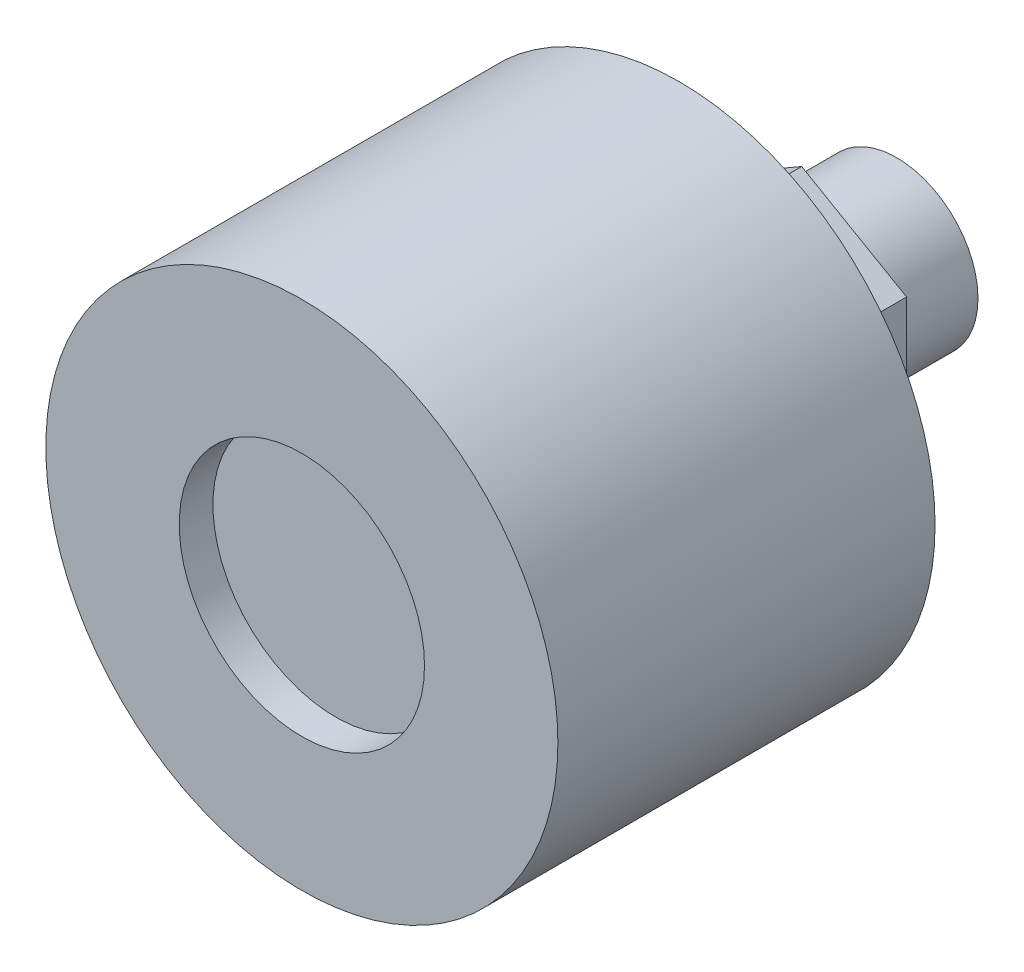
ISO-10303-21;
HEADER;
FILE_DESCRIPTION(('STEP AP214'),'2;1');
FILE_NAME('part.step','',(''),(''),'','','');
FILE_SCHEMA(('AUTOMOTIVE_DESIGN { 1 0 10303 214 1 1 1 1 }'));
ENDSEC;
DATA;
#1=APPLICATION_CONTEXT('core data for automotive mechanical design processes');
#2=APPLICATION_PROTOCOL_DEFINITION('international standard','automotive_design',2000,#1);
#3=PRODUCT_CONTEXT('',#1,'mechanical');
#4=PRODUCT('Part','Part','',(#3));
#5=PRODUCT_RELATED_PRODUCT_CATEGORY('part','',(#4));
#6=PRODUCT_DEFINITION_FORMATION('','',#4);
#7=PRODUCT_DEFINITION_CONTEXT('part definition',#1,'design');
#8=PRODUCT_DEFINITION('design','',#6,#7);
#9=PRODUCT_DEFINITION_SHAPE('','',#8);
#10=(LENGTH_UNIT() NAMED_UNIT(*) SI_UNIT(.MILLI.,.METRE.));
#11=(NAMED_UNIT(*) PLANE_ANGLE_UNIT() SI_UNIT($,.RADIAN.));
#12=(NAMED_UNIT(*) SI_UNIT($,.STERADIAN.) SOLID_ANGLE_UNIT());
#13=UNCERTAINTY_MEASURE_WITH_UNIT(LENGTH_MEASURE(1.E-05),#10,'distance_accuracy_value','');
#14=(GEOMETRIC_REPRESENTATION_CONTEXT(3) GLOBAL_UNCERTAINTY_ASSIGNED_CONTEXT((#13)) GLOBAL_UNIT_ASSIGNED_CONTEXT((#10,
#11,#12)) REPRESENTATION_CONTEXT('',''));
#15=CARTESIAN_POINT('',(0.,0.,0.));
#16=DIRECTION('',(0.,0.,1.));
#17=DIRECTION('',(1.,0.,0.));
#18=AXIS2_PLACEMENT_3D('',#15,#16,#17);
#19=CARTESIAN_POINT('',(0.,0.,-0.1));
#20=DIRECTION('',(0.,0.,1.));
#21=DIRECTION('',(1.,0.,0.));
#22=AXIS2_PLACEMENT_3D('',#19,#20,#21);
#23=CYLINDRICAL_SURFACE('',#22,8.35);
#24=CARTESIAN_POINT('',(0.,0.,1.));
#25=DIRECTION('',(0.,0.,1.));
#26=DIRECTION('',(1.,0.,0.));
#27=AXIS2_PLACEMENT_3D('',#24,#25,#26);
#28=CIRCLE('',#27,8.35);
#29=CARTESIAN_POINT('',(8.35,0.,1.));
#30=VERTEX_POINT('',#29);
#31=EDGE_CURVE('E120',#30,#30,#28,.T.);
#32=ORIENTED_EDGE('',*,*,#31,.F.);
#33=EDGE_LOOP('',(#32));
#34=FACE_BOUND('',#33,.T.);
#35=CARTESIAN_POINT('',(0.,0.,-11.3));
#36=DIRECTION('',(0.,0.,-1.));
#37=DIRECTION('',(-1.,0.,0.));
#38=AXIS2_PLACEMENT_3D('',#35,#36,#37);
#39=CIRCLE('',#38,8.35);
#40=CARTESIAN_POINT('',(-8.35,0.,-11.3));
#41=VERTEX_POINT('',#40);
#42=EDGE_CURVE('E110',#41,#41,#39,.T.);
#43=ORIENTED_EDGE('',*,*,#42,.F.);
#44=EDGE_LOOP('',(#43));
#45=FACE_BOUND('',#44,.T.);
#46=ADVANCED_FACE('F37',(#34,#45),#23,.T.);
#47=CARTESIAN_POINT('',(0.,0.,-0.1));
#48=DIRECTION('',(0.,0.,1.));
#49=DIRECTION('',(1.,0.,0.));
#50=AXIS2_PLACEMENT_3D('',#47,#48,#49);
#51=CYLINDRICAL_SURFACE('',#50,4.);
#52=CARTESIAN_POINT('',(0.,0.,-0.1));
#53=DIRECTION('',(0.,0.,1.));
#54=DIRECTION('',(1.,0.,0.));
#55=AXIS2_PLACEMENT_3D('',#52,#53,#54);
#56=CIRCLE('',#55,4.);
#57=CARTESIAN_POINT('',(4.,0.,-0.1));
#58=VERTEX_POINT('',#57);
#59=EDGE_CURVE('E40',#58,#58,#56,.T.);
#60=ORIENTED_EDGE('',*,*,#59,.F.);
#61=EDGE_LOOP('',(#60));
#62=FACE_BOUND('',#61,.T.);
#63=CARTESIAN_POINT('',(0.,0.,1.));
#64=DIRECTION('',(0.,0.,1.));
#65=DIRECTION('',(1.,0.,0.));
#66=AXIS2_PLACEMENT_3D('',#63,#64,#65);
#67=CIRCLE('',#66,4.);
#68=CARTESIAN_POINT('',(4.,0.,1.));
#69=VERTEX_POINT('',#68);
#70=EDGE_CURVE('E113',#69,#69,#67,.T.);
#71=ORIENTED_EDGE('',*,*,#70,.T.);
#72=EDGE_LOOP('',(#71));
#73=FACE_BOUND('',#72,.T.);
#74=ADVANCED_FACE('F129',(#62,#73),#51,.F.);
#75=CARTESIAN_POINT('',(0.,0.,1.));
#76=DIRECTION('',(0.,0.,1.));
#77=DIRECTION('',(1.,0.,0.));
#78=AXIS2_PLACEMENT_3D('',#75,#76,#77);
#79=PLANE('',#78);
#80=ORIENTED_EDGE('',*,*,#31,.T.);
#81=EDGE_LOOP('',(#80));
#82=FACE_BOUND('',#81,.T.);
#83=ORIENTED_EDGE('',*,*,#70,.F.);
#84=EDGE_LOOP('',(#83));
#85=FACE_BOUND('',#84,.T.);
#86=ADVANCED_FACE('F132',(#82,#85),#79,.T.);
#87=CARTESIAN_POINT('',(0.,0.,-0.1));
#88=DIRECTION('',(0.,0.,-1.));
#89=DIRECTION('',(-1.,0.,0.));
#90=AXIS2_PLACEMENT_3D('',#87,#88,#89);
#91=PLANE('',#90);
#92=ORIENTED_EDGE('',*,*,#59,.T.);
#93=EDGE_LOOP('',(#92));
#94=FACE_BOUND('',#93,.T.);
#95=ADVANCED_FACE('F127',(#94),#91,.F.);
#96=CARTESIAN_POINT('',(0.,0.,-11.3));
#97=DIRECTION('',(0.,0.,-1.));
#98=DIRECTION('',(-1.,0.,0.));
#99=AXIS2_PLACEMENT_3D('',#96,#97,#98);
#100=PLANE('',#99);
#101=DIRECTION('',(0.866025403784442,0.499999999999995,0.));
#102=VECTOR('',#101,1.);
#103=CARTESIAN_POINT('',(-3.42080034494851,1.97500000000004,-11.3));
#104=LINE('',#103,#102);
#105=CARTESIAN_POINT('',(-3.42080034494851,1.97500000000004,-11.3));
#106=VERTEX_POINT('',#105);
#107=CARTESIAN_POINT('',(0.,3.95,-11.3));
#108=VERTEX_POINT('',#107);
#109=EDGE_CURVE('E52',#106,#108,#104,.T.);
#110=ORIENTED_EDGE('',*,*,#109,.F.);
#111=DIRECTION('',(0.,1.,0.));
#112=VECTOR('',#111,1.);
#113=CARTESIAN_POINT('',(-3.42080034494855,-1.97499999999997,-11.3));
#114=LINE('',#113,#112);
#115=CARTESIAN_POINT('',(-3.42080034494855,-1.97499999999997,-11.3));
#116=VERTEX_POINT('',#115);
#117=EDGE_CURVE('E56',#116,#106,#114,.T.);
#118=ORIENTED_EDGE('',*,*,#117,.F.);
#119=DIRECTION('',(-0.866025403784436,0.500000000000004,0.));
#120=VECTOR('',#119,1.);
#121=CARTESIAN_POINT('',(0.,-3.95,-11.3));
#122=LINE('',#121,#120);
#123=CARTESIAN_POINT('',(0.,-3.95,-11.3));
#124=VERTEX_POINT('',#123);
#125=EDGE_CURVE('E221',#124,#116,#122,.T.);
#126=ORIENTED_EDGE('',*,*,#125,.F.);
#127=DIRECTION('',(-0.86602540378444,-0.499999999999998,0.));
#128=VECTOR('',#127,1.);
#129=CARTESIAN_POINT('',(3.42080034494852,-1.97500000000002,-11.3));
#130=LINE('',#129,#128);
#131=CARTESIAN_POINT('',(3.42080034494852,-1.97500000000002,-11.3));
#132=VERTEX_POINT('',#131);
#133=EDGE_CURVE('E218',#132,#124,#130,.T.);
#134=ORIENTED_EDGE('',*,*,#133,.F.);
#135=DIRECTION('',(0.,-1.,0.));
#136=VECTOR('',#135,1.);
#137=CARTESIAN_POINT('',(3.42080034494854,1.97499999999999,-11.3));
#138=LINE('',#137,#136);
#139=CARTESIAN_POINT('',(3.42080034494854,1.97499999999999,-11.3));
#140=VERTEX_POINT('',#139);
#141=EDGE_CURVE('E215',#140,#132,#138,.T.);
#142=ORIENTED_EDGE('',*,*,#141,.F.);
#143=DIRECTION('',(0.866025403784438,-0.500000000000001,0.));
#144=VECTOR('',#143,1.);
#145=CARTESIAN_POINT('',(0.,3.95,-11.3));
#146=LINE('',#145,#144);
#147=EDGE_CURVE('E213',#108,#140,#146,.T.);
#148=ORIENTED_EDGE('',*,*,#147,.F.);
#149=EDGE_LOOP('',(#110,#118,#126,#134,#142,#148));
#150=FACE_BOUND('',#149,.T.);
#151=ORIENTED_EDGE('',*,*,#42,.T.);
#152=EDGE_LOOP('',(#151));
#153=FACE_BOUND('',#152,.T.);
#154=ADVANCED_FACE('F140',(#150,#153),#100,.T.);
#155=CARTESIAN_POINT('',(-3.42080034494851,1.97500000000004,-15.3));
#156=DIRECTION('',(0.499999999999995,-0.866025403784442,0.));
#157=DIRECTION('',(0.866025403784442,0.499999999999995,0.));
#158=AXIS2_PLACEMENT_3D('',#155,#156,#157);
#159=PLANE('',#158);
#160=ORIENTED_EDGE('',*,*,#109,.T.);
#161=DIRECTION('',(0.,0.,1.));
#162=VECTOR('',#161,1.);
#163=CARTESIAN_POINT('',(0.,3.95,-15.3));
#164=LINE('',#163,#162);
#165=CARTESIAN_POINT('',(0.,3.95,-15.3));
#166=VERTEX_POINT('',#165);
#167=EDGE_CURVE('E93',#166,#108,#164,.T.);
#168=ORIENTED_EDGE('',*,*,#167,.F.);
#169=DIRECTION('',(0.866025403784442,0.499999999999995,0.));
#170=VECTOR('',#169,1.);
#171=CARTESIAN_POINT('',(-3.42080034494851,1.97500000000004,-15.3));
#172=LINE('',#171,#170);
#173=CARTESIAN_POINT('',(-3.42080034494851,1.97500000000004,-15.3));
#174=VERTEX_POINT('',#173);
#175=EDGE_CURVE('E99',#174,#166,#172,.T.);
#176=ORIENTED_EDGE('',*,*,#175,.F.);
#177=DIRECTION('',(0.,0.,1.));
#178=VECTOR('',#177,1.);
#179=CARTESIAN_POINT('',(-3.42080034494851,1.97500000000004,-15.3));
#180=LINE('',#179,#178);
#181=EDGE_CURVE('E211',#174,#106,#180,.T.);
#182=ORIENTED_EDGE('',*,*,#181,.T.);
#183=EDGE_LOOP('',(#160,#168,#176,#182));
#184=FACE_BOUND('',#183,.T.);
#185=ADVANCED_FACE('F109',(#184),#159,.F.);
#186=CARTESIAN_POINT('',(0.,3.95,-15.3));
#187=DIRECTION('',(-0.500000000000001,-0.866025403784438,0.));
#188=DIRECTION('',(0.866025403784438,-0.500000000000001,0.));
#189=AXIS2_PLACEMENT_3D('',#186,#187,#188);
#190=PLANE('',#189);
#191=ORIENTED_EDGE('',*,*,#147,.T.);
#192=DIRECTION('',(0.,0.,1.));
#193=VECTOR('',#192,1.);
#194=CARTESIAN_POINT('',(3.42080034494854,1.97499999999999,-15.3));
#195=LINE('',#194,#193);
#196=CARTESIAN_POINT('',(3.42080034494854,1.97499999999999,-15.3));
#197=VERTEX_POINT('',#196);
#198=EDGE_CURVE('E95',#197,#140,#195,.T.);
#199=ORIENTED_EDGE('',*,*,#198,.F.);
#200=DIRECTION('',(0.866025403784438,-0.500000000000001,0.));
#201=VECTOR('',#200,1.);
#202=CARTESIAN_POINT('',(0.,3.95,-15.3));
#203=LINE('',#202,#201);
#204=EDGE_CURVE('E88',#166,#197,#203,.T.);
#205=ORIENTED_EDGE('',*,*,#204,.F.);
#206=ORIENTED_EDGE('',*,*,#167,.T.);
#207=EDGE_LOOP('',(#191,#199,#205,#206));
#208=FACE_BOUND('',#207,.T.);
#209=ADVANCED_FACE('F91',(#208),#190,.F.);
#210=CARTESIAN_POINT('',(3.42080034494854,1.97499999999999,-15.3));
#211=DIRECTION('',(-1.,0.,0.));
#212=DIRECTION('',(0.,-1.,0.));
#213=AXIS2_PLACEMENT_3D('',#210,#211,#212);
#214=PLANE('',#213);
#215=ORIENTED_EDGE('',*,*,#141,.T.);
#216=DIRECTION('',(0.,0.,1.));
#217=VECTOR('',#216,1.);
#218=CARTESIAN_POINT('',(3.42080034494852,-1.97500000000002,-15.3));
#219=LINE('',#218,#217);
#220=CARTESIAN_POINT('',(3.42080034494852,-1.97500000000002,-15.3));
#221=VERTEX_POINT('',#220);
#222=EDGE_CURVE('E115',#221,#132,#219,.T.);
#223=ORIENTED_EDGE('',*,*,#222,.F.);
#224=DIRECTION('',(0.,-1.,0.));
#225=VECTOR('',#224,1.);
#226=CARTESIAN_POINT('',(3.42080034494854,1.97499999999999,-15.3));
#227=LINE('',#226,#225);
#228=EDGE_CURVE('E98',#197,#221,#227,.T.);
#229=ORIENTED_EDGE('',*,*,#228,.F.);
#230=ORIENTED_EDGE('',*,*,#198,.T.);
#231=EDGE_LOOP('',(#215,#223,#229,#230));
#232=FACE_BOUND('',#231,.T.);
#233=ADVANCED_FACE('F158',(#232),#214,.F.);
#234=CARTESIAN_POINT('',(3.42080034494852,-1.97500000000002,-15.3));
#235=DIRECTION('',(-0.499999999999998,0.86602540378444,0.));
#236=DIRECTION('',(-0.86602540378444,-0.499999999999998,0.));
#237=AXIS2_PLACEMENT_3D('',#234,#235,#236);
#238=PLANE('',#237);
#239=ORIENTED_EDGE('',*,*,#133,.T.);
#240=DIRECTION('',(0.,0.,1.));
#241=VECTOR('',#240,1.);
#242=CARTESIAN_POINT('',(0.,-3.95,-15.3));
#243=LINE('',#242,#241);
#244=CARTESIAN_POINT('',(0.,-3.95,-15.3));
#245=VERTEX_POINT('',#244);
#246=EDGE_CURVE('E228',#245,#124,#243,.T.);
#247=ORIENTED_EDGE('',*,*,#246,.F.);
#248=DIRECTION('',(-0.86602540378444,-0.499999999999998,0.));
#249=VECTOR('',#248,1.);
#250=CARTESIAN_POINT('',(3.42080034494852,-1.97500000000002,-15.3));
#251=LINE('',#250,#249);
#252=EDGE_CURVE('E206',#221,#245,#251,.T.);
#253=ORIENTED_EDGE('',*,*,#252,.F.);
#254=ORIENTED_EDGE('',*,*,#222,.T.);
#255=EDGE_LOOP('',(#239,#247,#253,#254));
#256=FACE_BOUND('',#255,.T.);
#257=ADVANCED_FACE('F161',(#256),#238,.F.);
#258=CARTESIAN_POINT('',(0.,-3.95,-15.3));
#259=DIRECTION('',(0.500000000000004,0.866025403784436,0.));
#260=DIRECTION('',(-0.866025403784436,0.500000000000004,0.));
#261=AXIS2_PLACEMENT_3D('',#258,#259,#260);
#262=PLANE('',#261);
#263=ORIENTED_EDGE('',*,*,#125,.T.);
#264=DIRECTION('',(0.,0.,1.));
#265=VECTOR('',#264,1.);
#266=CARTESIAN_POINT('',(-3.42080034494855,-1.97499999999997,-15.3));
#267=LINE('',#266,#265);
#268=CARTESIAN_POINT('',(-3.42080034494855,-1.97499999999997,-15.3));
#269=VERTEX_POINT('',#268);
#270=EDGE_CURVE('E225',#269,#116,#267,.T.);
#271=ORIENTED_EDGE('',*,*,#270,.F.);
#272=DIRECTION('',(-0.866025403784436,0.500000000000004,0.));
#273=VECTOR('',#272,1.);
#274=CARTESIAN_POINT('',(0.,-3.95,-15.3));
#275=LINE('',#274,#273);
#276=EDGE_CURVE('E208',#245,#269,#275,.T.);
#277=ORIENTED_EDGE('',*,*,#276,.F.);
#278=ORIENTED_EDGE('',*,*,#246,.T.);
#279=EDGE_LOOP('',(#263,#271,#277,#278));
#280=FACE_BOUND('',#279,.T.);
#281=ADVANCED_FACE('F165',(#280),#262,.F.);
#282=CARTESIAN_POINT('',(-3.42080034494855,-1.97499999999997,-15.3));
#283=DIRECTION('',(1.,0.,0.));
#284=DIRECTION('',(0.,1.,0.));
#285=AXIS2_PLACEMENT_3D('',#282,#283,#284);
#286=PLANE('',#285);
#287=ORIENTED_EDGE('',*,*,#117,.T.);
#288=ORIENTED_EDGE('',*,*,#181,.F.);
#289=DIRECTION('',(0.,1.,0.));
#290=VECTOR('',#289,1.);
#291=CARTESIAN_POINT('',(-3.42080034494855,-1.97499999999997,-15.3));
#292=LINE('',#291,#290);
#293=EDGE_CURVE('E104',#269,#174,#292,.T.);
#294=ORIENTED_EDGE('',*,*,#293,.F.);
#295=ORIENTED_EDGE('',*,*,#270,.T.);
#296=EDGE_LOOP('',(#287,#288,#294,#295));
#297=FACE_BOUND('',#296,.T.);
#298=ADVANCED_FACE('F169',(#297),#286,.F.);
#299=CARTESIAN_POINT('',(0.,0.,-15.3));
#300=DIRECTION('',(0.,0.,-1.));
#301=DIRECTION('',(-1.,0.,0.));
#302=AXIS2_PLACEMENT_3D('',#299,#300,#301);
#303=PLANE('',#302);
#304=CARTESIAN_POINT('',(0.,0.,-15.3));
#305=DIRECTION('',(0.,0.,-1.));
#306=DIRECTION('',(-1.,0.,0.));
#307=AXIS2_PLACEMENT_3D('',#304,#305,#306);
#308=CIRCLE('',#307,2.65);
#309=CARTESIAN_POINT('',(2.65,0.,-15.3));
#310=VERTEX_POINT('',#309);
#311=EDGE_CURVE('E11',#310,#310,#308,.T.);
#312=ORIENTED_EDGE('',*,*,#311,.F.);
#313=EDGE_LOOP('',(#312));
#314=FACE_BOUND('',#313,.T.);
#315=ORIENTED_EDGE('',*,*,#175,.T.);
#316=ORIENTED_EDGE('',*,*,#204,.T.);
#317=ORIENTED_EDGE('',*,*,#228,.T.);
#318=ORIENTED_EDGE('',*,*,#252,.T.);
#319=ORIENTED_EDGE('',*,*,#276,.T.);
#320=ORIENTED_EDGE('',*,*,#293,.T.);
#321=EDGE_LOOP('',(#315,#316,#317,#318,#319,#320));
#322=FACE_BOUND('',#321,.T.);
#323=ADVANCED_FACE('F102',(#314,#322),#303,.T.);
#324=CARTESIAN_POINT('',(0.,0.,-18.4));
#325=DIRECTION('',(0.,0.,1.));
#326=DIRECTION('',(1.,0.,0.));
#327=AXIS2_PLACEMENT_3D('',#324,#325,#326);
#328=CYLINDRICAL_SURFACE('',#327,2.65);
#329=CARTESIAN_POINT('',(0.,0.,-18.4));
#330=DIRECTION('',(0.,0.,-1.));
#331=DIRECTION('',(-1.,0.,0.));
#332=AXIS2_PLACEMENT_3D('',#329,#330,#331);
#333=CIRCLE('',#332,2.65);
#334=CARTESIAN_POINT('',(2.65,0.,-18.4));
#335=VERTEX_POINT('',#334);
#336=EDGE_CURVE('E197',#335,#335,#333,.T.);
#337=CARTESIAN_POINT('',(2.65,0.,-18.4));
#338=CARTESIAN_POINT('',(2.65,0.,-18.3677083333333));
#339=CARTESIAN_POINT('',(2.65,0.,-18.3354166666667));
#340=CARTESIAN_POINT('',(2.65,0.,-18.2708333333333));
#341=CARTESIAN_POINT('',(2.65,0.,-18.2385416666667));
#342=CARTESIAN_POINT('',(2.65,0.,-18.1739583333333));
#343=CARTESIAN_POINT('',(2.65,0.,-18.1416666666667));
#344=CARTESIAN_POINT('',(2.65,0.,-18.0770833333333));
#345=CARTESIAN_POINT('',(2.65,0.,-18.0447916666667));
#346=CARTESIAN_POINT('',(2.65,0.,-17.9802083333333));
#347=CARTESIAN_POINT('',(2.65,0.,-17.9479166666667));
#348=CARTESIAN_POINT('',(2.65,0.,-17.8833333333333));
#349=CARTESIAN_POINT('',(2.65,0.,-17.8510416666667));
#350=CARTESIAN_POINT('',(2.65,0.,-17.7864583333333));
#351=CARTESIAN_POINT('',(2.65,0.,-17.7541666666667));
#352=CARTESIAN_POINT('',(2.65,0.,-17.6895833333333));
#353=CARTESIAN_POINT('',(2.65,0.,-17.6572916666667));
#354=CARTESIAN_POINT('',(2.65,0.,-17.5927083333333));
#355=CARTESIAN_POINT('',(2.65,0.,-17.5604166666667));
#356=CARTESIAN_POINT('',(2.65,0.,-17.4958333333333));
#357=CARTESIAN_POINT('',(2.65,0.,-17.4635416666667));
#358=CARTESIAN_POINT('',(2.65,0.,-17.3989583333333));
#359=CARTESIAN_POINT('',(2.65,0.,-17.3666666666667));
#360=CARTESIAN_POINT('',(2.65,0.,-17.3020833333333));
#361=CARTESIAN_POINT('',(2.65,0.,-17.2697916666667));
#362=CARTESIAN_POINT('',(2.65,0.,-17.2052083333333));
#363=CARTESIAN_POINT('',(2.65,0.,-17.1729166666667));
#364=CARTESIAN_POINT('',(2.65,0.,-17.1083333333333));
#365=CARTESIAN_POINT('',(2.65,0.,-17.0760416666667));
#366=CARTESIAN_POINT('',(2.65,0.,-17.0114583333333));
#367=CARTESIAN_POINT('',(2.65,0.,-16.9791666666667));
#368=CARTESIAN_POINT('',(2.65,0.,-16.9145833333333));
#369=CARTESIAN_POINT('',(2.65,0.,-16.8822916666667));
#370=CARTESIAN_POINT('',(2.65,0.,-16.8177083333333));
#371=CARTESIAN_POINT('',(2.65,0.,-16.7854166666667));
#372=CARTESIAN_POINT('',(2.65,0.,-16.7208333333333));
#373=CARTESIAN_POINT('',(2.65,0.,-16.6885416666667));
#374=CARTESIAN_POINT('',(2.65,0.,-16.6239583333333));
#375=CARTESIAN_POINT('',(2.65,0.,-16.5916666666667));
#376=CARTESIAN_POINT('',(2.65,0.,-16.5270833333333));
#377=CARTESIAN_POINT('',(2.65,0.,-16.4947916666667));
#378=CARTESIAN_POINT('',(2.65,0.,-16.4302083333333));
#379=CARTESIAN_POINT('',(2.65,0.,-16.3979166666667));
#380=CARTESIAN_POINT('',(2.65,0.,-16.3333333333333));
#381=CARTESIAN_POINT('',(2.65,0.,-16.3010416666667));
#382=CARTESIAN_POINT('',(2.65,0.,-16.2364583333333));
#383=CARTESIAN_POINT('',(2.65,0.,-16.2041666666667));
#384=CARTESIAN_POINT('',(2.65,0.,-16.1395833333333));
#385=CARTESIAN_POINT('',(2.65,0.,-16.1072916666667));
#386=CARTESIAN_POINT('',(2.65,0.,-16.0427083333333));
#387=CARTESIAN_POINT('',(2.65,0.,-16.0104166666667));
#388=CARTESIAN_POINT('',(2.65,0.,-15.9458333333333));
#389=CARTESIAN_POINT('',(2.65,0.,-15.9135416666667));
#390=CARTESIAN_POINT('',(2.65,0.,-15.8489583333333));
#391=CARTESIAN_POINT('',(2.65,0.,-15.8166666666667));
#392=CARTESIAN_POINT('',(2.65,0.,-15.7520833333333));
#393=CARTESIAN_POINT('',(2.65,0.,-15.7197916666667));
#394=CARTESIAN_POINT('',(2.65,0.,-15.6552083333333));
#395=CARTESIAN_POINT('',(2.65,0.,-15.6229166666667));
#396=CARTESIAN_POINT('',(2.65,0.,-15.5583333333333));
#397=CARTESIAN_POINT('',(2.65,0.,-15.5260416666667));
#398=CARTESIAN_POINT('',(2.65,0.,-15.4614583333333));
#399=CARTESIAN_POINT('',(2.65,0.,-15.4291666666667));
#400=CARTESIAN_POINT('',(2.65,0.,-15.3645833333333));
#401=CARTESIAN_POINT('',(2.65,0.,-15.3322916666667));
#402=CARTESIAN_POINT('',(2.65,0.,-15.3));
#403=B_SPLINE_CURVE_WITH_KNOTS('',3,(#337,#338,#339,#340,#341,#342,#343,#344,#345,#346,#347,
#348,#349,#350,#351,#352,#353,#354,#355,#356,#357,#358,#359,#360,#361,#362,#363,#364,#365,#366,
#367,#368,#369,#370,#371,#372,#373,#374,#375,#376,#377,#378,#379,#380,#381,#382,#383,#384,#385,
#386,#387,#388,#389,#390,#391,#392,#393,#394,#395,#396,#397,#398,#399,#400,#401,#402),
.UNSPECIFIED.,.F.,.F.,(4,2,2,2,2,2,2,2,2,2,2,2,2,2,2,2,2,2,2,2,2,2,2,2,2,2,2,2,2,2,2,2,4),(0.,
0.0968749999999997,0.193749999999999,0.290624999999999,0.387499999999999,0.484374999999999,
0.581249999999998,0.678124999999998,0.774999999999998,0.871874999999998,0.968749999999997,
1.065625,1.1625,1.259375,1.35625,1.453125,1.55,1.646875,1.74375,1.840625,1.9375,2.034375,
2.13125,2.228125,2.325,2.421875,2.51875,2.615625,2.7125,2.809375,2.90625,3.003125,3.1),.UNSPECIFIED.);
#404=EDGE_CURVE('BSEAM176',#335,#310,#403,.T.);
#405=ORIENTED_EDGE('',*,*,#336,.F.);
#406=ORIENTED_EDGE('',*,*,#311,.T.);
#407=ORIENTED_EDGE('',*,*,#404,.T.);
#408=ORIENTED_EDGE('',*,*,#404,.F.);
#409=EDGE_LOOP('',(#405,#407,#406,#408));
#410=FACE_BOUND('',#409,.T.);
#411=ADVANCED_FACE('F176',(#410),#328,.T.);
#412=CARTESIAN_POINT('',(0.,0.,-18.4));
#413=DIRECTION('',(0.,0.,-1.));
#414=DIRECTION('',(-1.,0.,0.));
#415=AXIS2_PLACEMENT_3D('',#412,#413,#414);
#416=PLANE('',#415);
#417=CARTESIAN_POINT('',(0.,0.,-18.4));
#418=DIRECTION('',(0.,0.,-1.));
#419=DIRECTION('',(-1.,0.,0.));
#420=AXIS2_PLACEMENT_3D('',#417,#418,#419);
#421=CIRCLE('',#420,0.244312337230213);
#422=CARTESIAN_POINT('',(-0.244312337230213,0.,-18.4));
#423=VERTEX_POINT('',#422);
#424=EDGE_CURVE('E198',#423,#423,#421,.T.);
#425=ORIENTED_EDGE('',*,*,#424,.F.);
#426=EDGE_LOOP('',(#425));
#427=FACE_BOUND('',#426,.T.);
#428=ORIENTED_EDGE('',*,*,#336,.T.);
#429=EDGE_LOOP('',(#428));
#430=FACE_BOUND('',#429,.T.);
#431=ADVANCED_FACE('F180',(#427,#430),#416,.T.);
#432=CARTESIAN_POINT('',(0.,0.,-16.4));
#433=DIRECTION('',(0.,0.,-1.));
#434=DIRECTION('',(-1.,0.,0.));
#435=AXIS2_PLACEMENT_3D('',#432,#433,#434);
#436=CYLINDRICAL_SURFACE('',#435,0.244312337230213);
#437=CARTESIAN_POINT('',(0.,0.,-16.4));
#438=DIRECTION('',(0.,0.,-1.));
#439=DIRECTION('',(-1.,0.,0.));
#440=AXIS2_PLACEMENT_3D('',#437,#438,#439);
#441=CIRCLE('',#440,0.244312337230213);
#442=CARTESIAN_POINT('',(-0.244312337230213,0.,-16.4));
#443=VERTEX_POINT('',#442);
#444=EDGE_CURVE('E196',#443,#443,#441,.T.);
#445=ORIENTED_EDGE('',*,*,#444,.F.);
#446=EDGE_LOOP('',(#445));
#447=FACE_BOUND('',#446,.T.);
#448=ORIENTED_EDGE('',*,*,#424,.T.);
#449=EDGE_LOOP('',(#448));
#450=FACE_BOUND('',#449,.T.);
#451=ADVANCED_FACE('F184',(#447,#450),#436,.F.);
#452=CARTESIAN_POINT('',(0.,0.,-16.4));
#453=DIRECTION('',(0.,0.,-1.));
#454=DIRECTION('',(-1.,0.,0.));
#455=AXIS2_PLACEMENT_3D('',#452,#453,#454);
#456=PLANE('',#455);
#457=ORIENTED_EDGE('',*,*,#444,.T.);
#458=EDGE_LOOP('',(#457));
#459=FACE_BOUND('',#458,.T.);
#460=ADVANCED_FACE('F188',(#459),#456,.T.);
#461=CLOSED_SHELL('',(#46,#74,#86,#95,#154,#185,#209,#233,#257,#281,#298,#323,#411,#431,#451,#460));
#462=MANIFOLD_SOLID_BREP('B2',#461);
#463=ADVANCED_BREP_SHAPE_REPRESENTATION('',(#18,#462),#14);
#464=SHAPE_DEFINITION_REPRESENTATION(#9,#463);
ENDSEC;
END-ISO-10303-21;
